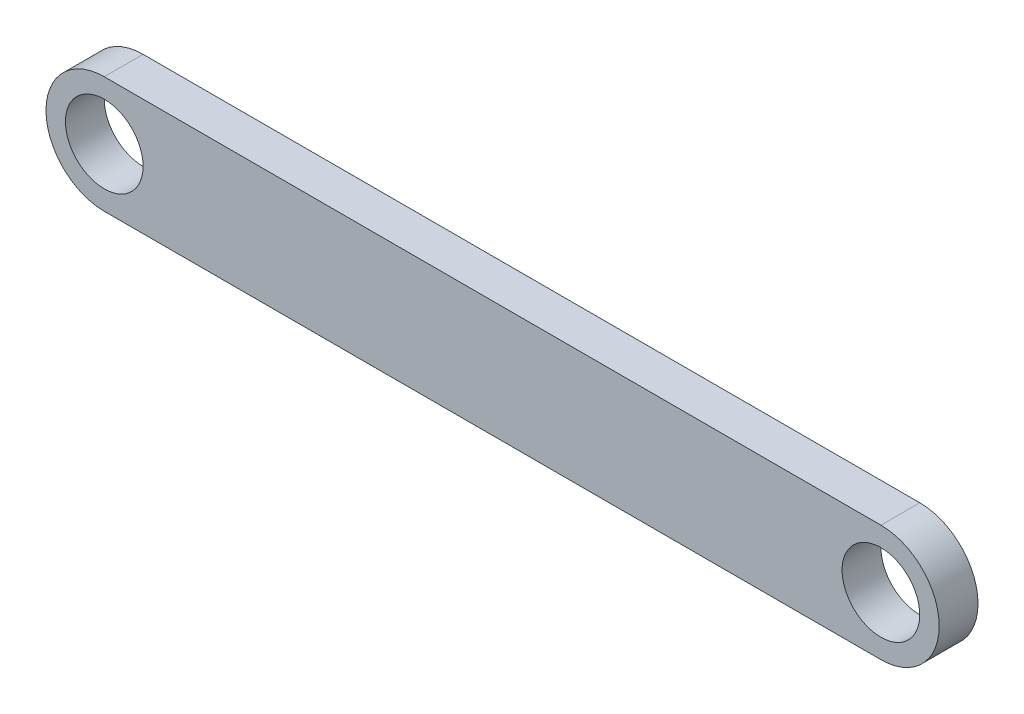
ISO-10303-21;
HEADER;
FILE_DESCRIPTION(('STEP AP214'),'2;1');
FILE_NAME('part.step','',(''),(''),'','','');
FILE_SCHEMA(('AUTOMOTIVE_DESIGN { 1 0 10303 214 1 1 1 1 }'));
ENDSEC;
DATA;
#1=APPLICATION_CONTEXT('core data for automotive mechanical design processes');
#2=APPLICATION_PROTOCOL_DEFINITION('international standard','automotive_design',2000,#1);
#3=PRODUCT_CONTEXT('',#1,'mechanical');
#4=PRODUCT('Part','Part','',(#3));
#5=PRODUCT_RELATED_PRODUCT_CATEGORY('part','',(#4));
#6=PRODUCT_DEFINITION_FORMATION('','',#4);
#7=PRODUCT_DEFINITION_CONTEXT('part definition',#1,'design');
#8=PRODUCT_DEFINITION('design','',#6,#7);
#9=PRODUCT_DEFINITION_SHAPE('','',#8);
#10=(LENGTH_UNIT() NAMED_UNIT(*) SI_UNIT(.MILLI.,.METRE.));
#11=(NAMED_UNIT(*) PLANE_ANGLE_UNIT() SI_UNIT($,.RADIAN.));
#12=(NAMED_UNIT(*) SI_UNIT($,.STERADIAN.) SOLID_ANGLE_UNIT());
#13=UNCERTAINTY_MEASURE_WITH_UNIT(LENGTH_MEASURE(1.E-05),#10,'distance_accuracy_value','');
#14=(GEOMETRIC_REPRESENTATION_CONTEXT(3) GLOBAL_UNCERTAINTY_ASSIGNED_CONTEXT((#13)) GLOBAL_UNIT_ASSIGNED_CONTEXT((#10,
#11,#12)) REPRESENTATION_CONTEXT('',''));
#15=CARTESIAN_POINT('',(0.,0.,0.));
#16=DIRECTION('',(0.,0.,1.));
#17=DIRECTION('',(1.,0.,0.));
#18=AXIS2_PLACEMENT_3D('',#15,#16,#17);
#19=CARTESIAN_POINT('',(-1.94289029309402E-13,0.,4.99999999999999));
#20=DIRECTION('',(0.,0.,1.));
#21=DIRECTION('',(1.00000000000002,0.,0.));
#22=AXIS2_PLACEMENT_3D('',#19,#20,#21);
#23=PLANE('',#22);
#24=CARTESIAN_POINT('',(-200.000000000004,-2.91433543964104E-13,5.00000000000034));
#25=DIRECTION('',(0.,0.,1.));
#26=DIRECTION('',(1.00000000000002,0.,0.));
#27=AXIS2_PLACEMENT_3D('',#24,#25,#26);
#28=CIRCLE('',#27,10.);
#29=CARTESIAN_POINT('',(-190.000000000003,-2.63677968348475E-13,5.00000000000033));
#30=VERTEX_POINT('',#29);
#31=EDGE_CURVE('E115',#30,#30,#28,.T.);
#32=ORIENTED_EDGE('',*,*,#31,.F.);
#33=EDGE_LOOP('',(#32));
#34=FACE_BOUND('',#33,.T.);
#35=CARTESIAN_POINT('',(-1.94289029309402E-13,0.,4.99999999999999));
#36=DIRECTION('',(0.,0.,1.));
#37=DIRECTION('',(1.00000000000002,0.,0.));
#38=AXIS2_PLACEMENT_3D('',#35,#36,#37);
#39=CIRCLE('',#38,15.);
#40=CARTESIAN_POINT('',(-1.66533453693773E-13,-14.9999999999999,5.00000000000008));
#41=VERTEX_POINT('',#40);
#42=CARTESIAN_POINT('',(0.,15.0000000000007,5.00000000000009));
#43=VERTEX_POINT('',#42);
#44=EDGE_CURVE('E94',#41,#43,#39,.T.);
#45=ORIENTED_EDGE('',*,*,#44,.T.);
#46=DIRECTION('',(-1.00000000000002,0.,0.));
#47=VECTOR('',#46,1.);
#48=CARTESIAN_POINT('',(0.,15.0000000000007,5.00000000000009));
#49=LINE('',#48,#47);
#50=CARTESIAN_POINT('',(-200.000000000004,15.,5.00000000000042));
#51=VERTEX_POINT('',#50);
#52=EDGE_CURVE('E89',#43,#51,#49,.T.);
#53=ORIENTED_EDGE('',*,*,#52,.T.);
#54=CARTESIAN_POINT('',(-200.000000000004,-2.91433543964104E-13,5.00000000000034));
#55=DIRECTION('',(0.,0.,1.));
#56=DIRECTION('',(1.00000000000002,0.,0.));
#57=AXIS2_PLACEMENT_3D('',#54,#55,#56);
#58=CIRCLE('',#57,15.);
#59=CARTESIAN_POINT('',(-200.000000000004,-15.0000000000007,5.00000000000025));
#60=VERTEX_POINT('',#59);
#61=EDGE_CURVE('E92',#51,#60,#58,.T.);
#62=ORIENTED_EDGE('',*,*,#61,.T.);
#63=DIRECTION('',(1.00000000000002,0.,0.));
#64=VECTOR('',#63,1.);
#65=CARTESIAN_POINT('',(-1.66533453693773E-13,-14.9999999999999,5.00000000000008));
#66=LINE('',#65,#64);
#67=EDGE_CURVE('E59',#60,#41,#66,.T.);
#68=ORIENTED_EDGE('',*,*,#67,.T.);
#69=EDGE_LOOP('',(#45,#53,#62,#68));
#70=FACE_BOUND('',#69,.T.);
#71=CARTESIAN_POINT('',(-1.94289029309402E-13,0.,4.99999999999999));
#72=DIRECTION('',(0.,0.,1.));
#73=DIRECTION('',(1.00000000000002,0.,0.));
#74=AXIS2_PLACEMENT_3D('',#71,#72,#73);
#75=CIRCLE('',#74,10.);
#76=CARTESIAN_POINT('',(9.99999999999997,0.,4.99999999999997));
#77=VERTEX_POINT('',#76);
#78=EDGE_CURVE('E139',#77,#77,#75,.T.);
#79=ORIENTED_EDGE('',*,*,#78,.F.);
#80=EDGE_LOOP('',(#79));
#81=FACE_BOUND('',#80,.T.);
#82=ADVANCED_FACE('F41',(#34,#70,#81),#23,.T.);
#83=CARTESIAN_POINT('',(-3.05311331771918E-13,1.52655665885959E-13,-5.));
#84=DIRECTION('',(0.,0.,1.));
#85=DIRECTION('',(1.00000000000002,0.,0.));
#86=AXIS2_PLACEMENT_3D('',#83,#84,#85);
#87=PLANE('',#86);
#88=CARTESIAN_POINT('',(-3.05311331771918E-13,1.52655665885959E-13,-5.));
#89=DIRECTION('',(0.,0.,1.));
#90=DIRECTION('',(1.00000000000002,0.,0.));
#91=AXIS2_PLACEMENT_3D('',#88,#89,#90);
#92=CIRCLE('',#91,15.);
#93=CARTESIAN_POINT('',(0.,-15.,-5.00000000000001));
#94=VERTEX_POINT('',#93);
#95=CARTESIAN_POINT('',(0.,15.0000000000004,-4.99999999999994));
#96=VERTEX_POINT('',#95);
#97=EDGE_CURVE('E111',#94,#96,#92,.T.);
#98=ORIENTED_EDGE('',*,*,#97,.F.);
#99=DIRECTION('',(1.00000000000002,0.,0.));
#100=VECTOR('',#99,1.);
#101=CARTESIAN_POINT('',(0.,-15.,-5.00000000000001));
#102=LINE('',#101,#100);
#103=CARTESIAN_POINT('',(-200.000000000004,-15.0000000000008,-4.99999999999963));
#104=VERTEX_POINT('',#103);
#105=EDGE_CURVE('E82',#104,#94,#102,.T.);
#106=ORIENTED_EDGE('',*,*,#105,.F.);
#107=CARTESIAN_POINT('',(-200.000000000004,-2.63677968348475E-13,-4.99999999999984));
#108=DIRECTION('',(0.,0.,1.));
#109=DIRECTION('',(1.00000000000002,0.,0.));
#110=AXIS2_PLACEMENT_3D('',#107,#108,#109);
#111=CIRCLE('',#110,15.);
#112=CARTESIAN_POINT('',(-200.000000000004,15.,-4.99999999999984));
#113=VERTEX_POINT('',#112);
#114=EDGE_CURVE('E76',#113,#104,#111,.T.);
#115=ORIENTED_EDGE('',*,*,#114,.F.);
#116=DIRECTION('',(-1.00000000000002,0.,0.));
#117=VECTOR('',#116,1.);
#118=CARTESIAN_POINT('',(0.,15.0000000000004,-4.99999999999994));
#119=LINE('',#118,#117);
#120=EDGE_CURVE('E99',#96,#113,#119,.T.);
#121=ORIENTED_EDGE('',*,*,#120,.F.);
#122=EDGE_LOOP('',(#98,#106,#115,#121));
#123=FACE_BOUND('',#122,.T.);
#124=CARTESIAN_POINT('',(-200.000000000004,-2.63677968348475E-13,-4.99999999999984));
#125=DIRECTION('',(0.,0.,1.));
#126=DIRECTION('',(1.00000000000002,0.,0.));
#127=AXIS2_PLACEMENT_3D('',#124,#125,#126);
#128=CIRCLE('',#127,10.);
#129=CARTESIAN_POINT('',(-190.000000000004,-2.35922392732846E-13,-4.99999999999986));
#130=VERTEX_POINT('',#129);
#131=EDGE_CURVE('E135',#130,#130,#128,.T.);
#132=ORIENTED_EDGE('',*,*,#131,.T.);
#133=EDGE_LOOP('',(#132));
#134=FACE_BOUND('',#133,.T.);
#135=CARTESIAN_POINT('',(-3.05311331771918E-13,1.52655665885959E-13,-5.));
#136=DIRECTION('',(0.,0.,1.));
#137=DIRECTION('',(1.00000000000002,0.,0.));
#138=AXIS2_PLACEMENT_3D('',#135,#136,#137);
#139=CIRCLE('',#138,10.);
#140=CARTESIAN_POINT('',(9.99999999999986,1.80411241501588E-13,-5.00000000000002));
#141=VERTEX_POINT('',#140);
#142=EDGE_CURVE('E143',#141,#141,#139,.T.);
#143=ORIENTED_EDGE('',*,*,#142,.T.);
#144=EDGE_LOOP('',(#143));
#145=FACE_BOUND('',#144,.T.);
#146=ADVANCED_FACE('F129',(#123,#134,#145),#87,.F.);
#147=CARTESIAN_POINT('',(-1.94289029309402E-13,0.,4.99999999999999));
#148=DIRECTION('',(0.,0.,-1.));
#149=DIRECTION('',(-1.00000000000002,0.,0.));
#150=AXIS2_PLACEMENT_3D('',#147,#148,#149);
#151=CYLINDRICAL_SURFACE('',#150,15.);
#152=ORIENTED_EDGE('',*,*,#97,.T.);
#153=DIRECTION('',(0.,0.,-1.));
#154=VECTOR('',#153,1.);
#155=CARTESIAN_POINT('',(0.,15.0000000000007,5.00000000000009));
#156=LINE('',#155,#154);
#157=EDGE_CURVE('E11',#43,#96,#156,.T.);
#158=ORIENTED_EDGE('',*,*,#157,.F.);
#159=ORIENTED_EDGE('',*,*,#44,.F.);
#160=DIRECTION('',(0.,0.,-1.));
#161=VECTOR('',#160,1.);
#162=CARTESIAN_POINT('',(-1.66533453693773E-13,-14.9999999999999,5.00000000000008));
#163=LINE('',#162,#161);
#164=EDGE_CURVE('E107',#41,#94,#163,.T.);
#165=ORIENTED_EDGE('',*,*,#164,.T.);
#166=EDGE_LOOP('',(#152,#158,#159,#165));
#167=FACE_BOUND('',#166,.T.);
#168=ADVANCED_FACE('F43',(#167),#151,.T.);
#169=CARTESIAN_POINT('',(0.,15.0000000000007,5.00000000000009));
#170=DIRECTION('',(0.,-1.00000000000002,0.));
#171=DIRECTION('',(1.00000000000002,0.,0.));
#172=AXIS2_PLACEMENT_3D('',#169,#170,#171);
#173=PLANE('',#172);
#174=ORIENTED_EDGE('',*,*,#120,.T.);
#175=DIRECTION('',(0.,0.,-1.));
#176=VECTOR('',#175,1.);
#177=CARTESIAN_POINT('',(-200.000000000004,15.,5.00000000000042));
#178=LINE('',#177,#176);
#179=EDGE_CURVE('E51',#51,#113,#178,.T.);
#180=ORIENTED_EDGE('',*,*,#179,.F.);
#181=ORIENTED_EDGE('',*,*,#52,.F.);
#182=ORIENTED_EDGE('',*,*,#157,.T.);
#183=EDGE_LOOP('',(#174,#180,#181,#182));
#184=FACE_BOUND('',#183,.T.);
#185=ADVANCED_FACE('F98',(#184),#173,.F.);
#186=CARTESIAN_POINT('',(-200.000000000004,-2.91433543964104E-13,5.00000000000034));
#187=DIRECTION('',(0.,0.,-1.));
#188=DIRECTION('',(-1.00000000000002,0.,0.));
#189=AXIS2_PLACEMENT_3D('',#186,#187,#188);
#190=CYLINDRICAL_SURFACE('',#189,15.);
#191=ORIENTED_EDGE('',*,*,#114,.T.);
#192=DIRECTION('',(0.,0.,-1.));
#193=VECTOR('',#192,1.);
#194=CARTESIAN_POINT('',(-200.000000000004,-15.0000000000007,5.00000000000025));
#195=LINE('',#194,#193);
#196=EDGE_CURVE('E101',#60,#104,#195,.T.);
#197=ORIENTED_EDGE('',*,*,#196,.F.);
#198=ORIENTED_EDGE('',*,*,#61,.F.);
#199=ORIENTED_EDGE('',*,*,#179,.T.);
#200=EDGE_LOOP('',(#191,#197,#198,#199));
#201=FACE_BOUND('',#200,.T.);
#202=ADVANCED_FACE('F102',(#201),#190,.T.);
#203=CARTESIAN_POINT('',(-1.66533453693773E-13,-14.9999999999999,5.00000000000008));
#204=DIRECTION('',(0.,1.00000000000002,0.));
#205=DIRECTION('',(-1.00000000000002,0.,0.));
#206=AXIS2_PLACEMENT_3D('',#203,#204,#205);
#207=PLANE('',#206);
#208=ORIENTED_EDGE('',*,*,#105,.T.);
#209=ORIENTED_EDGE('',*,*,#164,.F.);
#210=ORIENTED_EDGE('',*,*,#67,.F.);
#211=ORIENTED_EDGE('',*,*,#196,.T.);
#212=EDGE_LOOP('',(#208,#209,#210,#211));
#213=FACE_BOUND('',#212,.T.);
#214=ADVANCED_FACE('F126',(#213),#207,.F.);
#215=CARTESIAN_POINT('',(-200.000000000004,-2.91433543964104E-13,5.00000000000034));
#216=DIRECTION('',(0.,0.,-1.));
#217=DIRECTION('',(-1.00000000000002,0.,0.));
#218=AXIS2_PLACEMENT_3D('',#215,#216,#217);
#219=CYLINDRICAL_SURFACE('',#218,10.);
#220=ORIENTED_EDGE('',*,*,#31,.T.);
#221=EDGE_LOOP('',(#220));
#222=FACE_BOUND('',#221,.T.);
#223=ORIENTED_EDGE('',*,*,#131,.F.);
#224=EDGE_LOOP('',(#223));
#225=FACE_BOUND('',#224,.T.);
#226=ADVANCED_FACE('F164',(#222,#225),#219,.F.);
#227=CARTESIAN_POINT('',(-1.94289029309402E-13,0.,4.99999999999999));
#228=DIRECTION('',(0.,0.,-1.));
#229=DIRECTION('',(-1.00000000000002,0.,0.));
#230=AXIS2_PLACEMENT_3D('',#227,#228,#229);
#231=CYLINDRICAL_SURFACE('',#230,10.);
#232=ORIENTED_EDGE('',*,*,#78,.T.);
#233=EDGE_LOOP('',(#232));
#234=FACE_BOUND('',#233,.T.);
#235=ORIENTED_EDGE('',*,*,#142,.F.);
#236=EDGE_LOOP('',(#235));
#237=FACE_BOUND('',#236,.T.);
#238=ADVANCED_FACE('F152',(#234,#237),#231,.F.);
#239=CLOSED_SHELL('',(#82,#146,#168,#185,#202,#214,#226,#238));
#240=MANIFOLD_SOLID_BREP('B2',#239);
#241=ADVANCED_BREP_SHAPE_REPRESENTATION('',(#18,#240),#14);
#242=SHAPE_DEFINITION_REPRESENTATION(#9,#241);
ENDSEC;
END-ISO-10303-21;
